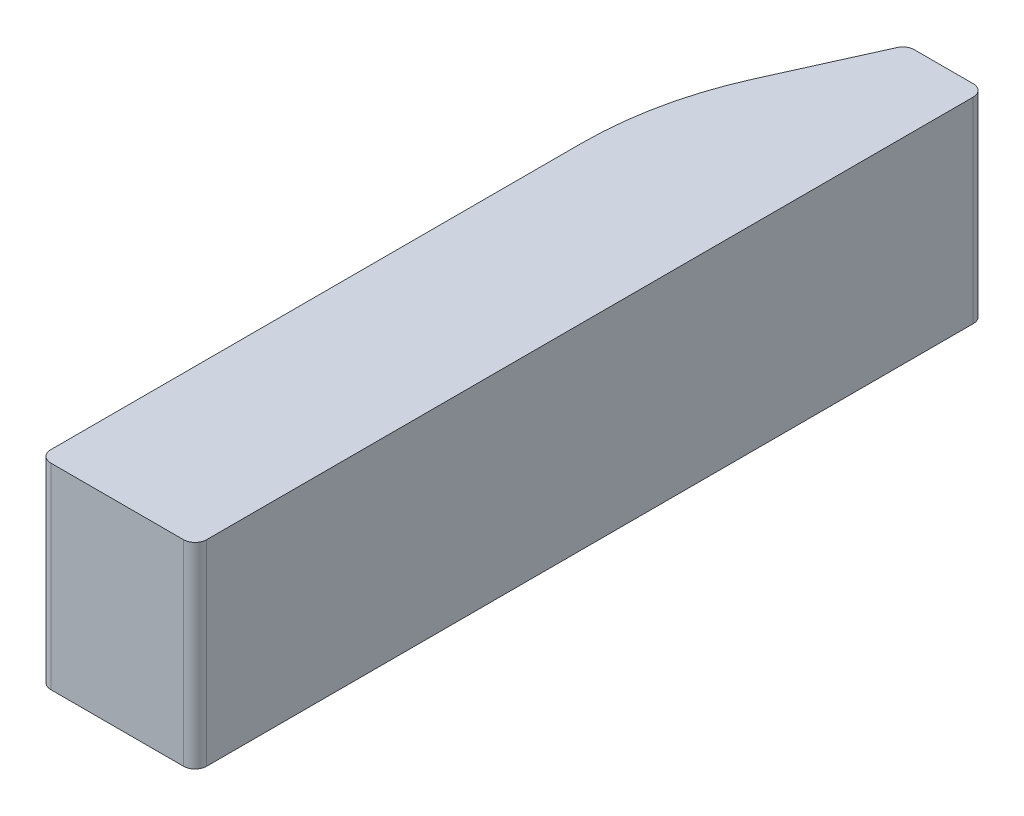
ISO-10303-21;
HEADER;
FILE_DESCRIPTION(('STEP AP214'),'2;1');
FILE_NAME('part.step','',(''),(''),'','','');
FILE_SCHEMA(('AUTOMOTIVE_DESIGN { 1 0 10303 214 1 1 1 1 }'));
ENDSEC;
DATA;
#1=APPLICATION_CONTEXT('core data for automotive mechanical design processes');
#2=APPLICATION_PROTOCOL_DEFINITION('international standard','automotive_design',2000,#1);
#3=PRODUCT_CONTEXT('',#1,'mechanical');
#4=PRODUCT('Part','Part','',(#3));
#5=PRODUCT_RELATED_PRODUCT_CATEGORY('part','',(#4));
#6=PRODUCT_DEFINITION_FORMATION('','',#4);
#7=PRODUCT_DEFINITION_CONTEXT('part definition',#1,'design');
#8=PRODUCT_DEFINITION('design','',#6,#7);
#9=PRODUCT_DEFINITION_SHAPE('','',#8);
#10=(LENGTH_UNIT() NAMED_UNIT(*) SI_UNIT(.MILLI.,.METRE.));
#11=(NAMED_UNIT(*) PLANE_ANGLE_UNIT() SI_UNIT($,.RADIAN.));
#12=(NAMED_UNIT(*) SI_UNIT($,.STERADIAN.) SOLID_ANGLE_UNIT());
#13=UNCERTAINTY_MEASURE_WITH_UNIT(LENGTH_MEASURE(1.E-05),#10,'distance_accuracy_value','');
#14=(GEOMETRIC_REPRESENTATION_CONTEXT(3) GLOBAL_UNCERTAINTY_ASSIGNED_CONTEXT((#13)) GLOBAL_UNIT_ASSIGNED_CONTEXT((#10,
#11,#12)) REPRESENTATION_CONTEXT('',''));
#15=CARTESIAN_POINT('',(0.,0.,0.));
#16=DIRECTION('',(0.,0.,1.));
#17=DIRECTION('',(1.,0.,0.));
#18=AXIS2_PLACEMENT_3D('',#15,#16,#17);
#19=CARTESIAN_POINT('',(0.,17.,0.));
#20=DIRECTION('',(1.,0.,0.));
#21=DIRECTION('',(0.,0.,-1.));
#22=AXIS2_PLACEMENT_3D('',#19,#20,#21);
#23=PLANE('',#22);
#24=DIRECTION('',(0.,-1.,0.));
#25=VECTOR('',#24,1.);
#26=CARTESIAN_POINT('',(0.,17.,-1.));
#27=LINE('',#26,#25);
#28=CARTESIAN_POINT('',(0.,0.,-1.));
#29=VERTEX_POINT('',#28);
#30=CARTESIAN_POINT('',(0.,17.,-1.));
#31=VERTEX_POINT('',#30);
#32=EDGE_CURVE('E225',#29,#31,#27,.F.);
#33=ORIENTED_EDGE('',*,*,#32,.T.);
#34=DIRECTION('',(0.,0.,1.));
#35=VECTOR('',#34,1.);
#36=CARTESIAN_POINT('',(0.,17.,0.));
#37=LINE('',#36,#35);
#38=CARTESIAN_POINT('',(0.,17.,-46.960959335129));
#39=VERTEX_POINT('',#38);
#40=EDGE_CURVE('E182',#39,#31,#37,.T.);
#41=ORIENTED_EDGE('',*,*,#40,.F.);
#42=DIRECTION('',(0.,1.,0.));
#43=VECTOR('',#42,1.);
#44=CARTESIAN_POINT('',(0.,17.,-46.960959335129));
#45=LINE('',#44,#43);
#46=CARTESIAN_POINT('',(0.,5.5,-46.9609593351288));
#47=VERTEX_POINT('',#46);
#48=EDGE_CURVE('E154',#39,#47,#45,.F.);
#49=ORIENTED_EDGE('',*,*,#48,.T.);
#50=DIRECTION('',(0.,1.,0.));
#51=VECTOR('',#50,1.);
#52=CARTESIAN_POINT('',(0.,-20.3577969726261,-46.9609593351288));
#53=LINE('',#52,#51);
#54=CARTESIAN_POINT('',(0.,0.,-46.9609593351288));
#55=VERTEX_POINT('',#54);
#56=EDGE_CURVE('E146',#55,#47,#53,.T.);
#57=ORIENTED_EDGE('',*,*,#56,.F.);
#58=DIRECTION('',(0.,0.,1.));
#59=VECTOR('',#58,1.);
#60=CARTESIAN_POINT('',(0.,0.,0.));
#61=LINE('',#60,#59);
#62=EDGE_CURVE('E129',#55,#29,#61,.T.);
#63=ORIENTED_EDGE('',*,*,#62,.T.);
#64=EDGE_LOOP('',(#33,#41,#49,#57,#63));
#65=FACE_BOUND('',#64,.T.);
#66=ADVANCED_FACE('F35',(#65),#23,.F.);
#67=CARTESIAN_POINT('',(0.,17.,0.));
#68=DIRECTION('',(0.,0.,-1.));
#69=DIRECTION('',(-1.,0.,0.));
#70=AXIS2_PLACEMENT_3D('',#67,#68,#69);
#71=PLANE('',#70);
#72=DIRECTION('',(1.,0.,0.));
#73=VECTOR('',#72,1.);
#74=CARTESIAN_POINT('',(0.,17.,0.));
#75=LINE('',#74,#73);
#76=CARTESIAN_POINT('',(1.,17.,0.));
#77=VERTEX_POINT('',#76);
#78=CARTESIAN_POINT('',(12.5,17.,0.));
#79=VERTEX_POINT('',#78);
#80=EDGE_CURVE('E184',#77,#79,#75,.T.);
#81=ORIENTED_EDGE('',*,*,#80,.F.);
#82=DIRECTION('',(0.,-1.,0.));
#83=VECTOR('',#82,1.);
#84=CARTESIAN_POINT('',(1.,17.,0.));
#85=LINE('',#84,#83);
#86=CARTESIAN_POINT('',(1.,0.,0.));
#87=VERTEX_POINT('',#86);
#88=EDGE_CURVE('E215',#77,#87,#85,.T.);
#89=ORIENTED_EDGE('',*,*,#88,.T.);
#90=DIRECTION('',(1.,0.,0.));
#91=VECTOR('',#90,1.);
#92=CARTESIAN_POINT('',(0.,0.,0.));
#93=LINE('',#92,#91);
#94=CARTESIAN_POINT('',(12.5,0.,0.));
#95=VERTEX_POINT('',#94);
#96=EDGE_CURVE('E141',#87,#95,#93,.T.);
#97=ORIENTED_EDGE('',*,*,#96,.T.);
#98=DIRECTION('',(0.,-1.,0.));
#99=VECTOR('',#98,1.);
#100=CARTESIAN_POINT('',(12.5,17.,0.));
#101=LINE('',#100,#99);
#102=EDGE_CURVE('E213',#95,#79,#101,.F.);
#103=ORIENTED_EDGE('',*,*,#102,.T.);
#104=EDGE_LOOP('',(#81,#89,#97,#103));
#105=FACE_BOUND('',#104,.T.);
#106=ADVANCED_FACE('F264',(#105),#71,.F.);
#107=CARTESIAN_POINT('',(13.5,17.,0.));
#108=DIRECTION('',(-1.,0.,0.));
#109=DIRECTION('',(0.,0.,1.));
#110=AXIS2_PLACEMENT_3D('',#107,#108,#109);
#111=PLANE('',#110);
#112=DIRECTION('',(0.,0.,-1.));
#113=VECTOR('',#112,1.);
#114=CARTESIAN_POINT('',(13.5,17.,0.));
#115=LINE('',#114,#113);
#116=CARTESIAN_POINT('',(13.5,17.,-1.));
#117=VERTEX_POINT('',#116);
#118=CARTESIAN_POINT('',(13.5,17.,-67.4));
#119=VERTEX_POINT('',#118);
#120=EDGE_CURVE('E188',#117,#119,#115,.T.);
#121=ORIENTED_EDGE('',*,*,#120,.F.);
#122=DIRECTION('',(0.,-1.,0.));
#123=VECTOR('',#122,1.);
#124=CARTESIAN_POINT('',(13.5,17.,-1.));
#125=LINE('',#124,#123);
#126=CARTESIAN_POINT('',(13.5,0.,-1.));
#127=VERTEX_POINT('',#126);
#128=EDGE_CURVE('E235',#117,#127,#125,.T.);
#129=ORIENTED_EDGE('',*,*,#128,.T.);
#130=DIRECTION('',(0.,0.,-1.));
#131=VECTOR('',#130,1.);
#132=CARTESIAN_POINT('',(13.5,0.,0.));
#133=LINE('',#132,#131);
#134=CARTESIAN_POINT('',(13.5,0.,-67.4));
#135=VERTEX_POINT('',#134);
#136=EDGE_CURVE('E195',#127,#135,#133,.T.);
#137=ORIENTED_EDGE('',*,*,#136,.T.);
#138=DIRECTION('',(0.,-1.,0.));
#139=VECTOR('',#138,1.);
#140=CARTESIAN_POINT('',(13.5,17.,-67.4));
#141=LINE('',#140,#139);
#142=EDGE_CURVE('E233',#135,#119,#141,.F.);
#143=ORIENTED_EDGE('',*,*,#142,.T.);
#144=EDGE_LOOP('',(#121,#129,#137,#143));
#145=FACE_BOUND('',#144,.T.);
#146=ADVANCED_FACE('F271',(#145),#111,.F.);
#147=CARTESIAN_POINT('',(0.,17.,-68.4));
#148=DIRECTION('',(0.,0.,1.));
#149=DIRECTION('',(1.,0.,0.));
#150=AXIS2_PLACEMENT_3D('',#147,#148,#149);
#151=PLANE('',#150);
#152=DIRECTION('',(-1.,0.,0.));
#153=VECTOR('',#152,1.);
#154=CARTESIAN_POINT('',(0.,17.,-68.4));
#155=LINE('',#154,#153);
#156=CARTESIAN_POINT('',(12.5,17.,-68.4));
#157=VERTEX_POINT('',#156);
#158=CARTESIAN_POINT('',(7.39658560997307,17.,-68.4));
#159=VERTEX_POINT('',#158);
#160=EDGE_CURVE('E190',#157,#159,#155,.T.);
#161=ORIENTED_EDGE('',*,*,#160,.F.);
#162=DIRECTION('',(0.,-1.,0.));
#163=VECTOR('',#162,1.);
#164=CARTESIAN_POINT('',(12.5,17.,-68.4));
#165=LINE('',#164,#163);
#166=CARTESIAN_POINT('',(12.5,0.,-68.4));
#167=VERTEX_POINT('',#166);
#168=EDGE_CURVE('E43',#157,#167,#165,.T.);
#169=ORIENTED_EDGE('',*,*,#168,.T.);
#170=DIRECTION('',(-1.,0.,0.));
#171=VECTOR('',#170,1.);
#172=CARTESIAN_POINT('',(0.,0.,-68.4));
#173=LINE('',#172,#171);
#174=CARTESIAN_POINT('',(7.39658560997307,0.,-68.4));
#175=VERTEX_POINT('',#174);
#176=EDGE_CURVE('E185',#167,#175,#173,.T.);
#177=ORIENTED_EDGE('',*,*,#176,.T.);
#178=DIRECTION('',(0.,1.,0.));
#179=VECTOR('',#178,1.);
#180=CARTESIAN_POINT('',(7.39658560997307,17.,-68.4));
#181=LINE('',#180,#179);
#182=EDGE_CURVE('E238',#175,#159,#181,.T.);
#183=ORIENTED_EDGE('',*,*,#182,.T.);
#184=EDGE_LOOP('',(#161,#169,#177,#183));
#185=FACE_BOUND('',#184,.T.);
#186=ADVANCED_FACE('F243',(#185),#151,.F.);
#187=CARTESIAN_POINT('',(0.,17.,0.));
#188=DIRECTION('',(0.,-1.,0.));
#189=DIRECTION('',(0.,0.,-1.));
#190=AXIS2_PLACEMENT_3D('',#187,#188,#189);
#191=PLANE('',#190);
#192=ORIENTED_EDGE('',*,*,#40,.T.);
#193=CARTESIAN_POINT('',(1.,17.,-1.));
#194=DIRECTION('',(0.,-1.,0.));
#195=DIRECTION('',(0.,0.,-1.));
#196=AXIS2_PLACEMENT_3D('',#193,#194,#195);
#197=CIRCLE('',#196,1.);
#198=EDGE_CURVE('E231',#31,#77,#197,.F.);
#199=ORIENTED_EDGE('',*,*,#198,.T.);
#200=ORIENTED_EDGE('',*,*,#80,.T.);
#201=CARTESIAN_POINT('',(12.5,17.,-1.));
#202=DIRECTION('',(0.,-1.,0.));
#203=DIRECTION('',(0.,0.,-1.));
#204=AXIS2_PLACEMENT_3D('',#201,#202,#203);
#205=CIRCLE('',#204,1.);
#206=EDGE_CURVE('E229',#79,#117,#205,.F.);
#207=ORIENTED_EDGE('',*,*,#206,.T.);
#208=ORIENTED_EDGE('',*,*,#120,.T.);
#209=CARTESIAN_POINT('',(12.5,17.,-67.4));
#210=DIRECTION('',(0.,-1.,0.));
#211=DIRECTION('',(0.,0.,-1.));
#212=AXIS2_PLACEMENT_3D('',#209,#210,#211);
#213=CIRCLE('',#212,1.);
#214=EDGE_CURVE('E58',#119,#157,#213,.F.);
#215=ORIENTED_EDGE('',*,*,#214,.T.);
#216=ORIENTED_EDGE('',*,*,#160,.T.);
#217=CARTESIAN_POINT('',(7.39658560997307,17.,-67.4));
#218=DIRECTION('',(0.,-1.,0.));
#219=DIRECTION('',(0.,0.,-1.));
#220=AXIS2_PLACEMENT_3D('',#217,#218,#219);
#221=CIRCLE('',#220,1.);
#222=CARTESIAN_POINT('',(6.48466410479796,17.,-67.8103646773288));
#223=VERTEX_POINT('',#222);
#224=EDGE_CURVE('E50',#159,#223,#221,.F.);
#225=ORIENTED_EDGE('',*,*,#224,.T.);
#226=DIRECTION('',(0.410364677328798,0.,-0.911921505175107));
#227=VECTOR('',#226,1.);
#228=CARTESIAN_POINT('',(0.,17.,-53.4));
#229=LINE('',#228,#227);
#230=CARTESIAN_POINT('',(2.64235484474681,17.,-59.2718996549929));
#231=VERTEX_POINT('',#230);
#232=EDGE_CURVE('E164',#231,#223,#229,.T.);
#233=ORIENTED_EDGE('',*,*,#232,.F.);
#234=CARTESIAN_POINT('',(30.,17.,-46.960959335129));
#235=DIRECTION('',(0.,-1.,0.));
#236=DIRECTION('',(0.,0.,-1.));
#237=AXIS2_PLACEMENT_3D('',#234,#235,#236);
#238=CIRCLE('',#237,30.);
#239=EDGE_CURVE('E202',#231,#39,#238,.F.);
#240=ORIENTED_EDGE('',*,*,#239,.T.);
#241=EDGE_LOOP('',(#192,#199,#200,#207,#208,#215,#216,#225,#233,#240));
#242=FACE_BOUND('',#241,.T.);
#243=ADVANCED_FACE('F248',(#242),#191,.F.);
#244=CARTESIAN_POINT('',(0.,0.,0.));
#245=DIRECTION('',(0.,-1.,0.));
#246=DIRECTION('',(0.,0.,-1.));
#247=AXIS2_PLACEMENT_3D('',#244,#245,#246);
#248=PLANE('',#247);
#249=DIRECTION('',(-1.,0.,0.));
#250=VECTOR('',#249,1.);
#251=CARTESIAN_POINT('',(0.,0.,-46.9609593351288));
#252=LINE('',#251,#250);
#253=CARTESIAN_POINT('',(-0.0156162659484898,0.,-46.9609593351288));
#254=VERTEX_POINT('',#253);
#255=EDGE_CURVE('E133',#55,#254,#252,.T.);
#256=ORIENTED_EDGE('',*,*,#255,.T.);
#257=DIRECTION('',(0.371390676354103,0.,-0.928476690885259));
#258=VECTOR('',#257,1.);
#259=CARTESIAN_POINT('',(0.,0.,-47.));
#260=LINE('',#259,#258);
#261=CARTESIAN_POINT('',(2.54858858705948E-05,0.,-47.0000637147147));
#262=VERTEX_POINT('',#261);
#263=EDGE_CURVE('E161',#254,#262,#260,.T.);
#264=ORIENTED_EDGE('',*,*,#263,.T.);
#265=CARTESIAN_POINT('',(30.,0.,-46.960959335129));
#266=DIRECTION('',(0.,-1.,0.));
#267=DIRECTION('',(0.,0.,-1.));
#268=AXIS2_PLACEMENT_3D('',#265,#266,#267);
#269=CIRCLE('',#268,30.);
#270=CARTESIAN_POINT('',(2.64235484474681,0.,-59.2718996549929));
#271=VERTEX_POINT('',#270);
#272=EDGE_CURVE('E205',#262,#271,#269,.T.);
#273=ORIENTED_EDGE('',*,*,#272,.T.);
#274=DIRECTION('',(0.410364677328798,0.,-0.911921505175107));
#275=VECTOR('',#274,1.);
#276=CARTESIAN_POINT('',(0.,0.,-53.4));
#277=LINE('',#276,#275);
#278=CARTESIAN_POINT('',(6.48466410479796,0.,-67.8103646773288));
#279=VERTEX_POINT('',#278);
#280=EDGE_CURVE('E168',#271,#279,#277,.T.);
#281=ORIENTED_EDGE('',*,*,#280,.T.);
#282=CARTESIAN_POINT('',(7.39658560997307,0.,-67.4));
#283=DIRECTION('',(0.,-1.,0.));
#284=DIRECTION('',(0.,0.,-1.));
#285=AXIS2_PLACEMENT_3D('',#282,#283,#284);
#286=CIRCLE('',#285,1.);
#287=EDGE_CURVE('E218',#279,#175,#286,.T.);
#288=ORIENTED_EDGE('',*,*,#287,.T.);
#289=ORIENTED_EDGE('',*,*,#176,.F.);
#290=CARTESIAN_POINT('',(12.5,0.,-67.4));
#291=DIRECTION('',(0.,-1.,0.));
#292=DIRECTION('',(0.,0.,-1.));
#293=AXIS2_PLACEMENT_3D('',#290,#291,#292);
#294=CIRCLE('',#293,1.);
#295=EDGE_CURVE('E220',#167,#135,#294,.T.);
#296=ORIENTED_EDGE('',*,*,#295,.T.);
#297=ORIENTED_EDGE('',*,*,#136,.F.);
#298=CARTESIAN_POINT('',(12.5,0.,-1.));
#299=DIRECTION('',(0.,-1.,0.));
#300=DIRECTION('',(0.,0.,-1.));
#301=AXIS2_PLACEMENT_3D('',#298,#299,#300);
#302=CIRCLE('',#301,1.);
#303=EDGE_CURVE('E222',#127,#95,#302,.T.);
#304=ORIENTED_EDGE('',*,*,#303,.T.);
#305=ORIENTED_EDGE('',*,*,#96,.F.);
#306=CARTESIAN_POINT('',(1.,0.,-1.));
#307=DIRECTION('',(0.,-1.,0.));
#308=DIRECTION('',(0.,0.,-1.));
#309=AXIS2_PLACEMENT_3D('',#306,#307,#308);
#310=CIRCLE('',#309,1.);
#311=EDGE_CURVE('E136',#87,#29,#310,.T.);
#312=ORIENTED_EDGE('',*,*,#311,.T.);
#313=ORIENTED_EDGE('',*,*,#62,.F.);
#314=EDGE_LOOP('',(#256,#264,#273,#281,#288,#289,#296,#297,#304,#305,#312,#313));
#315=FACE_BOUND('',#314,.T.);
#316=CARTESIAN_POINT('',(8.5,0.,-47.4));
#317=DIRECTION('',(0.,-1.,0.));
#318=DIRECTION('',(0.,0.,-1.));
#319=AXIS2_PLACEMENT_3D('',#316,#317,#318);
#320=CIRCLE('',#319,2.75000000000001);
#321=CARTESIAN_POINT('',(8.5,0.,-50.15));
#322=VERTEX_POINT('',#321);
#323=EDGE_CURVE('E174',#322,#322,#320,.T.);
#324=ORIENTED_EDGE('',*,*,#323,.F.);
#325=EDGE_LOOP('',(#324));
#326=FACE_BOUND('',#325,.T.);
#327=CARTESIAN_POINT('',(8.49999999999999,0.,-11.));
#328=DIRECTION('',(0.,-1.,0.));
#329=DIRECTION('',(0.,0.,1.));
#330=AXIS2_PLACEMENT_3D('',#327,#328,#329);
#331=CIRCLE('',#330,2.75);
#332=CARTESIAN_POINT('',(8.49999999999999,0.,-8.25000000000001));
#333=VERTEX_POINT('',#332);
#334=EDGE_CURVE('E171',#333,#333,#331,.T.);
#335=ORIENTED_EDGE('',*,*,#334,.F.);
#336=EDGE_LOOP('',(#335));
#337=FACE_BOUND('',#336,.T.);
#338=ADVANCED_FACE('F131',(#315,#326,#337),#248,.T.);
#339=CARTESIAN_POINT('',(8.49999999999999,5.,-11.));
#340=DIRECTION('',(0.,-1.,0.));
#341=DIRECTION('',(0.,0.,-1.));
#342=AXIS2_PLACEMENT_3D('',#339,#340,#341);
#343=CYLINDRICAL_SURFACE('',#342,2.75);
#344=CARTESIAN_POINT('',(8.49999999999999,5.,-11.));
#345=DIRECTION('',(0.,-1.,0.));
#346=DIRECTION('',(0.,0.,1.));
#347=AXIS2_PLACEMENT_3D('',#344,#345,#346);
#348=CIRCLE('',#347,2.75);
#349=CARTESIAN_POINT('',(8.49999999999999,5.,-8.25000000000001));
#350=VERTEX_POINT('',#349);
#351=EDGE_CURVE('E177',#350,#350,#348,.T.);
#352=ORIENTED_EDGE('',*,*,#351,.F.);
#353=EDGE_LOOP('',(#352));
#354=FACE_BOUND('',#353,.T.);
#355=ORIENTED_EDGE('',*,*,#334,.T.);
#356=EDGE_LOOP('',(#355));
#357=FACE_BOUND('',#356,.T.);
#358=ADVANCED_FACE('F339',(#354,#357),#343,.F.);
#359=CARTESIAN_POINT('',(8.49999999999999,5.,-11.));
#360=DIRECTION('',(0.,1.,0.));
#361=DIRECTION('',(0.,0.,1.));
#362=AXIS2_PLACEMENT_3D('',#359,#360,#361);
#363=PLANE('',#362);
#364=ORIENTED_EDGE('',*,*,#351,.T.);
#365=EDGE_LOOP('',(#364));
#366=FACE_BOUND('',#365,.T.);
#367=ADVANCED_FACE('F382',(#366),#363,.F.);
#368=CARTESIAN_POINT('',(8.5,5.,-47.4));
#369=DIRECTION('',(0.,-1.,0.));
#370=DIRECTION('',(0.,0.,-1.));
#371=AXIS2_PLACEMENT_3D('',#368,#369,#370);
#372=CYLINDRICAL_SURFACE('',#371,2.75000000000001);
#373=CARTESIAN_POINT('',(8.5,5.,-47.4));
#374=DIRECTION('',(0.,-1.,0.));
#375=DIRECTION('',(0.,0.,-1.));
#376=AXIS2_PLACEMENT_3D('',#373,#374,#375);
#377=CIRCLE('',#376,2.75000000000001);
#378=CARTESIAN_POINT('',(8.5,5.,-50.15));
#379=VERTEX_POINT('',#378);
#380=EDGE_CURVE('E142',#379,#379,#377,.T.);
#381=ORIENTED_EDGE('',*,*,#380,.F.);
#382=EDGE_LOOP('',(#381));
#383=FACE_BOUND('',#382,.T.);
#384=ORIENTED_EDGE('',*,*,#323,.T.);
#385=EDGE_LOOP('',(#384));
#386=FACE_BOUND('',#385,.T.);
#387=ADVANCED_FACE('F378',(#383,#386),#372,.F.);
#388=CARTESIAN_POINT('',(8.5,5.,-47.4));
#389=DIRECTION('',(0.,-1.,0.));
#390=DIRECTION('',(0.,0.,-1.));
#391=AXIS2_PLACEMENT_3D('',#388,#389,#390);
#392=PLANE('',#391);
#393=ORIENTED_EDGE('',*,*,#380,.T.);
#394=EDGE_LOOP('',(#393));
#395=FACE_BOUND('',#394,.T.);
#396=ADVANCED_FACE('F375',(#395),#392,.T.);
#397=CARTESIAN_POINT('',(0.,-16.448784149596,-53.4));
#398=DIRECTION('',(0.911921505175106,0.,0.410364677328798));
#399=DIRECTION('',(0.410364677328798,0.,-0.911921505175107));
#400=AXIS2_PLACEMENT_3D('',#397,#398,#399);
#401=PLANE('',#400);
#402=ORIENTED_EDGE('',*,*,#232,.T.);
#403=DIRECTION('',(0.,1.,0.));
#404=VECTOR('',#403,1.);
#405=CARTESIAN_POINT('',(6.48466410479796,-16.448784149596,-67.8103646773288));
#406=LINE('',#405,#404);
#407=EDGE_CURVE('E11',#223,#279,#406,.F.);
#408=ORIENTED_EDGE('',*,*,#407,.T.);
#409=ORIENTED_EDGE('',*,*,#280,.F.);
#410=DIRECTION('',(0.,1.,0.));
#411=VECTOR('',#410,1.);
#412=CARTESIAN_POINT('',(2.64235484474681,-16.448784149596,-59.2718996549929));
#413=LINE('',#412,#411);
#414=EDGE_CURVE('E191',#271,#231,#413,.T.);
#415=ORIENTED_EDGE('',*,*,#414,.T.);
#416=EDGE_LOOP('',(#402,#408,#409,#415));
#417=FACE_BOUND('',#416,.T.);
#418=ADVANCED_FACE('F251',(#417),#401,.F.);
#419=CARTESIAN_POINT('',(0.,5.5,-47.));
#420=DIRECTION('',(-0.92847669088526,0.,-0.371390676354103));
#421=DIRECTION('',(-0.371390676354103,0.,0.92847669088526));
#422=AXIS2_PLACEMENT_3D('',#419,#420,#421);
#423=PLANE('',#422);
#424=DIRECTION('',(0.,-1.,0.));
#425=VECTOR('',#424,1.);
#426=CARTESIAN_POINT('',(-0.0156162659484898,5.5,-46.9609593351288));
#427=LINE('',#426,#425);
#428=CARTESIAN_POINT('',(-0.0156162659484898,5.5,-46.9609593351288));
#429=VERTEX_POINT('',#428);
#430=EDGE_CURVE('E149',#429,#254,#427,.T.);
#431=ORIENTED_EDGE('',*,*,#430,.F.);
#432=DIRECTION('',(0.371390676354103,0.,-0.928476690885259));
#433=VECTOR('',#432,1.);
#434=CARTESIAN_POINT('',(0.,5.5,-47.));
#435=LINE('',#434,#433);
#436=CARTESIAN_POINT('',(2.54858858710699E-05,5.5,-47.0000637147147));
#437=VERTEX_POINT('',#436);
#438=EDGE_CURVE('E162',#429,#437,#435,.T.);
#439=ORIENTED_EDGE('',*,*,#438,.T.);
#440=DIRECTION('',(0.,1.,0.));
#441=VECTOR('',#440,1.);
#442=CARTESIAN_POINT('',(2.54858858705948E-05,5.5,-47.0000637147147));
#443=LINE('',#442,#441);
#444=EDGE_CURVE('E210',#437,#262,#443,.F.);
#445=ORIENTED_EDGE('',*,*,#444,.T.);
#446=ORIENTED_EDGE('',*,*,#263,.F.);
#447=EDGE_LOOP('',(#431,#439,#445,#446));
#448=FACE_BOUND('',#447,.T.);
#449=ADVANCED_FACE('F346',(#448),#423,.T.);
#450=CARTESIAN_POINT('',(0.,5.5,0.));
#451=DIRECTION('',(0.,-1.,0.));
#452=DIRECTION('',(0.,0.,-1.));
#453=AXIS2_PLACEMENT_3D('',#450,#451,#452);
#454=PLANE('',#453);
#455=ORIENTED_EDGE('',*,*,#438,.F.);
#456=DIRECTION('',(1.,0.,0.));
#457=VECTOR('',#456,1.);
#458=CARTESIAN_POINT('',(0.,5.5,-46.9609593351288));
#459=LINE('',#458,#457);
#460=EDGE_CURVE('E156',#429,#47,#459,.T.);
#461=ORIENTED_EDGE('',*,*,#460,.T.);
#462=CARTESIAN_POINT('',(30.,5.5,-46.960959335129));
#463=DIRECTION('',(0.,-1.,0.));
#464=DIRECTION('',(0.,0.,-1.));
#465=AXIS2_PLACEMENT_3D('',#462,#463,#464);
#466=CIRCLE('',#465,30.);
#467=EDGE_CURVE('E207',#47,#437,#466,.T.);
#468=ORIENTED_EDGE('',*,*,#467,.T.);
#469=EDGE_LOOP('',(#455,#461,#468));
#470=FACE_BOUND('',#469,.T.);
#471=ADVANCED_FACE('F290',(#470),#454,.F.);
#472=CARTESIAN_POINT('',(30.,-16.448784149596,-46.960959335129));
#473=DIRECTION('',(0.,1.,0.));
#474=DIRECTION('',(0.,0.,1.));
#475=AXIS2_PLACEMENT_3D('',#472,#473,#474);
#476=CYLINDRICAL_SURFACE('',#475,30.);
#477=ORIENTED_EDGE('',*,*,#467,.F.);
#478=ORIENTED_EDGE('',*,*,#48,.F.);
#479=ORIENTED_EDGE('',*,*,#239,.F.);
#480=ORIENTED_EDGE('',*,*,#414,.F.);
#481=ORIENTED_EDGE('',*,*,#272,.F.);
#482=ORIENTED_EDGE('',*,*,#444,.F.);
#483=EDGE_LOOP('',(#477,#478,#479,#480,#481,#482));
#484=FACE_BOUND('',#483,.T.);
#485=ADVANCED_FACE('F255',(#484),#476,.T.);
#486=CARTESIAN_POINT('',(1.,17.,-1.));
#487=DIRECTION('',(0.,-1.,0.));
#488=DIRECTION('',(0.,0.,-1.));
#489=AXIS2_PLACEMENT_3D('',#486,#487,#488);
#490=CYLINDRICAL_SURFACE('',#489,1.);
#491=ORIENTED_EDGE('',*,*,#198,.F.);
#492=ORIENTED_EDGE('',*,*,#32,.F.);
#493=ORIENTED_EDGE('',*,*,#311,.F.);
#494=ORIENTED_EDGE('',*,*,#88,.F.);
#495=EDGE_LOOP('',(#491,#492,#493,#494));
#496=FACE_BOUND('',#495,.T.);
#497=ADVANCED_FACE('F260',(#496),#490,.T.);
#498=CARTESIAN_POINT('',(12.5,17.,-1.));
#499=DIRECTION('',(0.,-1.,0.));
#500=DIRECTION('',(0.,0.,-1.));
#501=AXIS2_PLACEMENT_3D('',#498,#499,#500);
#502=CYLINDRICAL_SURFACE('',#501,1.);
#503=ORIENTED_EDGE('',*,*,#206,.F.);
#504=ORIENTED_EDGE('',*,*,#102,.F.);
#505=ORIENTED_EDGE('',*,*,#303,.F.);
#506=ORIENTED_EDGE('',*,*,#128,.F.);
#507=EDGE_LOOP('',(#503,#504,#505,#506));
#508=FACE_BOUND('',#507,.T.);
#509=ADVANCED_FACE('F267',(#508),#502,.T.);
#510=CARTESIAN_POINT('',(12.5,17.,-67.4));
#511=DIRECTION('',(0.,-1.,0.));
#512=DIRECTION('',(0.,0.,-1.));
#513=AXIS2_PLACEMENT_3D('',#510,#511,#512);
#514=CYLINDRICAL_SURFACE('',#513,1.);
#515=ORIENTED_EDGE('',*,*,#214,.F.);
#516=ORIENTED_EDGE('',*,*,#142,.F.);
#517=ORIENTED_EDGE('',*,*,#295,.F.);
#518=ORIENTED_EDGE('',*,*,#168,.F.);
#519=EDGE_LOOP('',(#515,#516,#517,#518));
#520=FACE_BOUND('',#519,.T.);
#521=ADVANCED_FACE('F273',(#520),#514,.T.);
#522=CARTESIAN_POINT('',(7.39658560997307,17.,-67.4));
#523=DIRECTION('',(0.,1.,0.));
#524=DIRECTION('',(0.,0.,1.));
#525=AXIS2_PLACEMENT_3D('',#522,#523,#524);
#526=CYLINDRICAL_SURFACE('',#525,1.);
#527=ORIENTED_EDGE('',*,*,#287,.F.);
#528=ORIENTED_EDGE('',*,*,#407,.F.);
#529=ORIENTED_EDGE('',*,*,#224,.F.);
#530=ORIENTED_EDGE('',*,*,#182,.F.);
#531=EDGE_LOOP('',(#527,#528,#529,#530));
#532=FACE_BOUND('',#531,.T.);
#533=ADVANCED_FACE('F37',(#532),#526,.T.);
#534=CARTESIAN_POINT('',(0.,-20.3577969726261,-46.9609593351288));
#535=DIRECTION('',(0.,0.,-1.));
#536=DIRECTION('',(-1.,0.,0.));
#537=AXIS2_PLACEMENT_3D('',#534,#535,#536);
#538=PLANE('',#537);
#539=ORIENTED_EDGE('',*,*,#430,.T.);
#540=ORIENTED_EDGE('',*,*,#255,.F.);
#541=ORIENTED_EDGE('',*,*,#56,.T.);
#542=ORIENTED_EDGE('',*,*,#460,.F.);
#543=EDGE_LOOP('',(#539,#540,#541,#542));
#544=FACE_BOUND('',#543,.T.);
#545=ADVANCED_FACE('F145',(#544),#538,.F.);
#546=CLOSED_SHELL('',(#66,#106,#146,#186,#243,#338,#358,#367,#387,#396,#418,#449,#471,#485,#497,
#509,#521,#533,#545));
#547=MANIFOLD_SOLID_BREP('B2',#546);
#548=ADVANCED_BREP_SHAPE_REPRESENTATION('',(#18,#547),#14);
#549=SHAPE_DEFINITION_REPRESENTATION(#9,#548);
ENDSEC;
END-ISO-10303-21;
